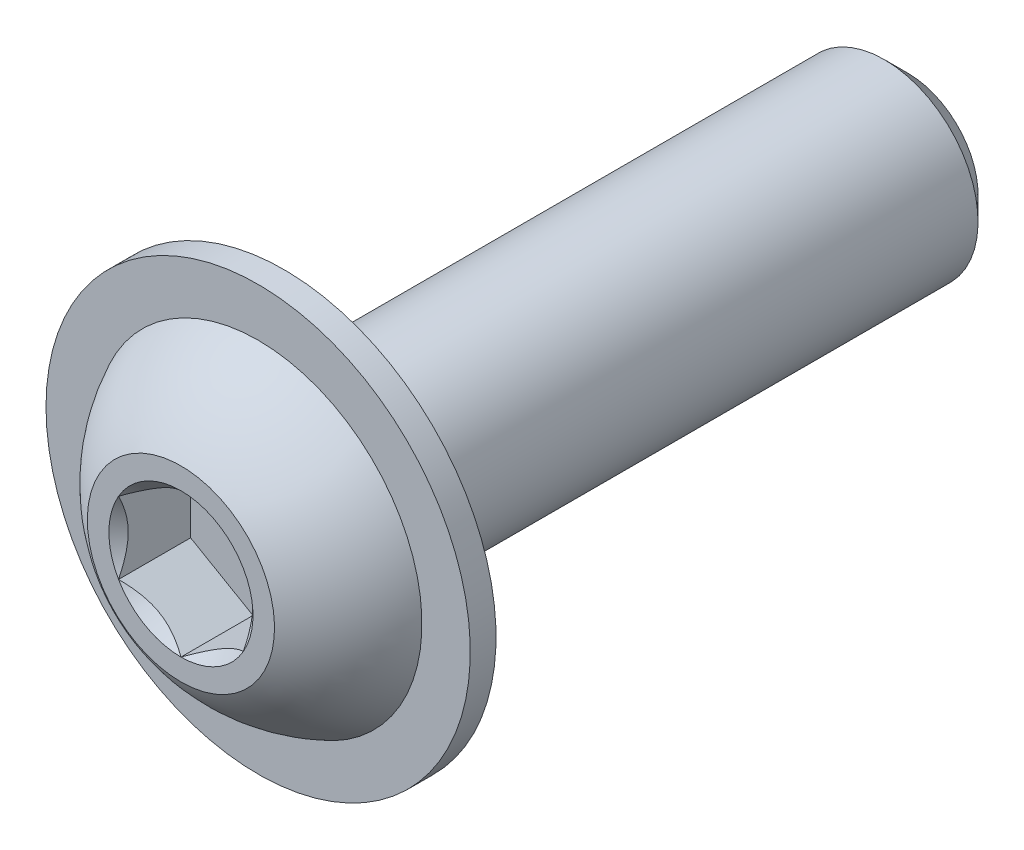
ISO-10303-21;
HEADER;
FILE_DESCRIPTION(('STEP AP214'),'2;1');
FILE_NAME('part.step','',(''),(''),'','','');
FILE_SCHEMA(('AUTOMOTIVE_DESIGN { 1 0 10303 214 1 1 1 1 }'));
ENDSEC;
DATA;
#1=APPLICATION_CONTEXT('core data for automotive mechanical design processes');
#2=APPLICATION_PROTOCOL_DEFINITION('international standard','automotive_design',2000,#1);
#3=PRODUCT_CONTEXT('',#1,'mechanical');
#4=PRODUCT('Part','Part','',(#3));
#5=PRODUCT_RELATED_PRODUCT_CATEGORY('part','',(#4));
#6=PRODUCT_DEFINITION_FORMATION('','',#4);
#7=PRODUCT_DEFINITION_CONTEXT('part definition',#1,'design');
#8=PRODUCT_DEFINITION('design','',#6,#7);
#9=PRODUCT_DEFINITION_SHAPE('','',#8);
#10=(LENGTH_UNIT() NAMED_UNIT(*) SI_UNIT(.MILLI.,.METRE.));
#11=(NAMED_UNIT(*) PLANE_ANGLE_UNIT() SI_UNIT($,.RADIAN.));
#12=(NAMED_UNIT(*) SI_UNIT($,.STERADIAN.) SOLID_ANGLE_UNIT());
#13=UNCERTAINTY_MEASURE_WITH_UNIT(LENGTH_MEASURE(1.E-05),#10,'distance_accuracy_value','');
#14=(GEOMETRIC_REPRESENTATION_CONTEXT(3) GLOBAL_UNCERTAINTY_ASSIGNED_CONTEXT((#13)) GLOBAL_UNIT_ASSIGNED_CONTEXT((#10,
#11,#12)) REPRESENTATION_CONTEXT('',''));
#15=CARTESIAN_POINT('',(0.,0.,0.));
#16=DIRECTION('',(0.,0.,1.));
#17=DIRECTION('',(1.,0.,0.));
#18=AXIS2_PLACEMENT_3D('',#15,#16,#17);
#19=CARTESIAN_POINT('',(0.,-3.,-23.3));
#20=DIRECTION('',(0.,0.,-1.));
#21=DIRECTION('',(0.,1.,0.));
#22=AXIS2_PLACEMENT_3D('',#19,#20,#21);
#23=PLANE('',#22);
#24=CARTESIAN_POINT('',(0.,0.,-23.3));
#25=DIRECTION('',(0.,0.,-1.));
#26=DIRECTION('',(0.,1.,0.));
#27=AXIS2_PLACEMENT_3D('',#24,#25,#26);
#28=CIRCLE('',#27,2.25000000000001);
#29=CARTESIAN_POINT('',(0.,2.25000000000001,-23.3));
#30=VERTEX_POINT('',#29);
#31=EDGE_CURVE('E203',#30,#30,#28,.T.);
#32=ORIENTED_EDGE('',*,*,#31,.T.);
#33=EDGE_LOOP('',(#32));
#34=FACE_BOUND('',#33,.T.);
#35=ADVANCED_FACE('F41',(#34),#23,.T.);
#36=CARTESIAN_POINT('',(0.,0.,-23.3));
#37=DIRECTION('',(0.,0.,-1.));
#38=DIRECTION('',(0.,1.,0.));
#39=AXIS2_PLACEMENT_3D('',#36,#37,#38);
#40=CYLINDRICAL_SURFACE('',#39,3.);
#41=CARTESIAN_POINT('',(0.,0.,-22.55));
#42=DIRECTION('',(0.,0.,-1.));
#43=DIRECTION('',(0.,1.,0.));
#44=AXIS2_PLACEMENT_3D('',#41,#42,#43);
#45=CIRCLE('',#44,3.);
#46=CARTESIAN_POINT('',(0.,3.,-22.55));
#47=VERTEX_POINT('',#46);
#48=EDGE_CURVE('E56',#47,#47,#45,.F.);
#49=ORIENTED_EDGE('',*,*,#48,.T.);
#50=EDGE_LOOP('',(#49));
#51=FACE_BOUND('',#50,.T.);
#52=CARTESIAN_POINT('',(0.,0.,-3.3));
#53=DIRECTION('',(0.,0.,1.));
#54=DIRECTION('',(1.,0.,0.));
#55=AXIS2_PLACEMENT_3D('',#52,#53,#54);
#56=CIRCLE('',#55,3.);
#57=CARTESIAN_POINT('',(3.,0.,-3.3));
#58=VERTEX_POINT('',#57);
#59=EDGE_CURVE('E199',#58,#58,#56,.F.);
#60=ORIENTED_EDGE('',*,*,#59,.T.);
#61=EDGE_LOOP('',(#60));
#62=FACE_BOUND('',#61,.T.);
#63=ADVANCED_FACE('F210',(#51,#62),#40,.T.);
#64=CARTESIAN_POINT('',(0.,0.,-23.3));
#65=DIRECTION('',(0.,0.,1.));
#66=DIRECTION('',(0.,-1.,0.));
#67=AXIS2_PLACEMENT_3D('',#64,#65,#66);
#68=CONICAL_SURFACE('',#67,2.25000000000001,0.785398163397445);
#69=ORIENTED_EDGE('',*,*,#48,.F.);
#70=EDGE_LOOP('',(#69));
#71=FACE_BOUND('',#70,.T.);
#72=ORIENTED_EDGE('',*,*,#31,.F.);
#73=EDGE_LOOP('',(#72));
#74=FACE_BOUND('',#73,.T.);
#75=ADVANCED_FACE('F43',(#71,#74),#68,.T.);
#76=CARTESIAN_POINT('',(0.,-5.25,-3.3));
#77=DIRECTION('',(0.,0.,1.));
#78=DIRECTION('',(1.,0.,0.));
#79=AXIS2_PLACEMENT_3D('',#76,#77,#78);
#80=PLANE('',#79);
#81=ORIENTED_EDGE('',*,*,#59,.F.);
#82=EDGE_LOOP('',(#81));
#83=FACE_BOUND('',#82,.T.);
#84=CARTESIAN_POINT('',(0.,0.,-3.3));
#85=DIRECTION('',(0.,0.,-1.));
#86=DIRECTION('',(-1.,0.,0.));
#87=AXIS2_PLACEMENT_3D('',#84,#85,#86);
#88=CIRCLE('',#87,6.8);
#89=CARTESIAN_POINT('',(-6.8,0.,-3.3));
#90=VERTEX_POINT('',#89);
#91=EDGE_CURVE('E188',#90,#90,#88,.T.);
#92=ORIENTED_EDGE('',*,*,#91,.T.);
#93=EDGE_LOOP('',(#92));
#94=FACE_BOUND('',#93,.T.);
#95=ADVANCED_FACE('F215',(#83,#94),#80,.F.);
#96=CARTESIAN_POINT('',(0.,0.,-2.475));
#97=DIRECTION('',(0.,0.,-1.));
#98=DIRECTION('',(-1.,0.,0.));
#99=AXIS2_PLACEMENT_3D('',#96,#97,#98);
#100=PLANE('',#99);
#101=CARTESIAN_POINT('',(0.,0.,-2.475));
#102=DIRECTION('',(0.,0.,-1.));
#103=DIRECTION('',(-1.,0.,0.));
#104=AXIS2_PLACEMENT_3D('',#101,#102,#103);
#105=CIRCLE('',#104,6.8);
#106=CARTESIAN_POINT('',(-6.8,0.,-2.475));
#107=VERTEX_POINT('',#106);
#108=EDGE_CURVE('E183',#107,#107,#105,.T.);
#109=ORIENTED_EDGE('',*,*,#108,.F.);
#110=EDGE_LOOP('',(#109));
#111=FACE_BOUND('',#110,.T.);
#112=CARTESIAN_POINT('',(0.,0.,-2.475));
#113=DIRECTION('',(0.,0.,-1.));
#114=DIRECTION('',(-1.,0.,0.));
#115=AXIS2_PLACEMENT_3D('',#112,#113,#114);
#116=CIRCLE('',#115,5.25);
#117=CARTESIAN_POINT('',(0.,-5.25,-2.475));
#118=VERTEX_POINT('',#117);
#119=EDGE_CURVE('E187',#118,#118,#116,.T.);
#120=ORIENTED_EDGE('',*,*,#119,.T.);
#121=EDGE_LOOP('',(#120));
#122=FACE_BOUND('',#121,.T.);
#123=ADVANCED_FACE('F233',(#111,#122),#100,.F.);
#124=CARTESIAN_POINT('',(0.,0.,-2.475));
#125=DIRECTION('',(0.,0.,-1.));
#126=DIRECTION('',(-1.,0.,0.));
#127=AXIS2_PLACEMENT_3D('',#124,#125,#126);
#128=CYLINDRICAL_SURFACE('',#127,6.8);
#129=ORIENTED_EDGE('',*,*,#108,.T.);
#130=EDGE_LOOP('',(#129));
#131=FACE_BOUND('',#130,.T.);
#132=ORIENTED_EDGE('',*,*,#91,.F.);
#133=EDGE_LOOP('',(#132));
#134=FACE_BOUND('',#133,.T.);
#135=ADVANCED_FACE('F230',(#131,#134),#128,.T.);
#136=CARTESIAN_POINT('',(0.,-3.,0.));
#137=DIRECTION('',(0.,0.,-1.));
#138=DIRECTION('',(-1.,0.,0.));
#139=AXIS2_PLACEMENT_3D('',#136,#137,#138);
#140=PLANE('',#139);
#141=CARTESIAN_POINT('',(0.,0.,0.));
#142=DIRECTION('',(0.,0.,1.));
#143=DIRECTION('',(1.,0.,0.));
#144=AXIS2_PLACEMENT_3D('',#141,#142,#143);
#145=CIRCLE('',#144,2.3094010767585);
#146=CARTESIAN_POINT('',(-2.,1.15470053837925,0.));
#147=VERTEX_POINT('',#146);
#148=CARTESIAN_POINT('',(-2.,-1.15470053837925,0.));
#149=VERTEX_POINT('',#148);
#150=EDGE_CURVE('E69',#147,#149,#145,.T.);
#151=ORIENTED_EDGE('',*,*,#150,.F.);
#152=CARTESIAN_POINT('',(0.,2.3094010767585,0.));
#153=VERTEX_POINT('',#152);
#154=EDGE_CURVE('E146',#153,#147,#145,.T.);
#155=ORIENTED_EDGE('',*,*,#154,.F.);
#156=CARTESIAN_POINT('',(2.,1.15470053837925,0.));
#157=VERTEX_POINT('',#156);
#158=EDGE_CURVE('E141',#157,#153,#145,.T.);
#159=ORIENTED_EDGE('',*,*,#158,.F.);
#160=CARTESIAN_POINT('',(2.,-1.15470053837925,0.));
#161=VERTEX_POINT('',#160);
#162=EDGE_CURVE('E110',#161,#157,#145,.T.);
#163=ORIENTED_EDGE('',*,*,#162,.F.);
#164=CARTESIAN_POINT('',(0.,-2.3094010767585,0.));
#165=VERTEX_POINT('',#164);
#166=EDGE_CURVE('E101',#165,#161,#145,.T.);
#167=ORIENTED_EDGE('',*,*,#166,.F.);
#168=EDGE_CURVE('E62',#149,#165,#145,.T.);
#169=ORIENTED_EDGE('',*,*,#168,.F.);
#170=EDGE_LOOP('',(#151,#155,#159,#163,#167,#169));
#171=FACE_BOUND('',#170,.T.);
#172=CARTESIAN_POINT('',(0.,0.,0.));
#173=DIRECTION('',(0.,0.,1.));
#174=DIRECTION('',(1.,0.,0.));
#175=AXIS2_PLACEMENT_3D('',#172,#173,#174);
#176=CIRCLE('',#175,3.);
#177=CARTESIAN_POINT('',(0.,-3.,0.));
#178=VERTEX_POINT('',#177);
#179=EDGE_CURVE('E195',#178,#178,#176,.T.);
#180=ORIENTED_EDGE('',*,*,#179,.T.);
#181=EDGE_LOOP('',(#180));
#182=FACE_BOUND('',#181,.T.);
#183=ADVANCED_FACE('F138',(#171,#182),#140,.F.);
#184=CARTESIAN_POINT('',(0.,0.,-4.9875));
#185=DIRECTION('',(0.,0.,1.));
#186=DIRECTION('',(0.,-1.,0.));
#187=AXIS2_PLACEMENT_3D('',#184,#185,#186);
#188=SPHERICAL_SURFACE('',#187,5.82023678642029);
#189=CARTESIAN_POINT('',(0.,-3.,0.));
#190=CARTESIAN_POINT('',(0.,-3.03028420289884,-0.0182160171404805));
#191=CARTESIAN_POINT('',(0.,-3.0604024537021,-0.0367079272921058));
#192=CARTESIAN_POINT('',(0.,-3.12029714687073,-0.0742372549628669));
#193=CARTESIAN_POINT('',(0.,-3.1500735892361,-0.0932746724820026));
#194=CARTESIAN_POINT('',(0.,-3.20927476128223,-0.131888736233004));
#195=CARTESIAN_POINT('',(0.,-3.23869949096298,-0.15146538246487));
#196=CARTESIAN_POINT('',(0.,-3.29718748048685,-0.191151397561356));
#197=CARTESIAN_POINT('',(0.,-3.32625074032996,-0.211260766425976));
#198=CARTESIAN_POINT('',(0.,-3.38400614482375,-0.252005556938247));
#199=CARTESIAN_POINT('',(0.,-3.41269828947443,-0.272640978585899));
#200=CARTESIAN_POINT('',(0.,-3.46970194355215,-0.314431026779949));
#201=CARTESIAN_POINT('',(0.,-3.4980134529792,-0.335585653326347));
#202=CARTESIAN_POINT('',(0.,-3.55424644229443,-0.378407092086537));
#203=CARTESIAN_POINT('',(0.,-3.5821679221826,-0.400073904300327));
#204=CARTESIAN_POINT('',(0.,-3.63761158767924,-0.4439125249629));
#205=CARTESIAN_POINT('',(0.,-3.66513377328771,-0.466084333411683));
#206=CARTESIAN_POINT('',(0.,-3.7197697179341,-0.510925589613356));
#207=CARTESIAN_POINT('',(0.,-3.74688347697201,-0.533595037366247));
#208=CARTESIAN_POINT('',(0.,-3.80069357171985,-0.579424050102975));
#209=CARTESIAN_POINT('',(0.,-3.82738990742978,-0.602583615086813));
#210=CARTESIAN_POINT('',(0.,-3.88035629726865,-0.649385177588692));
#211=CARTESIAN_POINT('',(0.,-3.90662635139759,-0.673027175106733));
#212=CARTESIAN_POINT('',(0.,-3.95873146126904,-0.720785757900494));
#213=CARTESIAN_POINT('',(0.,-3.98456651701155,-0.744902343176214));
#214=CARTESIAN_POINT('',(0.,-4.03579305764359,-0.793602099233681));
#215=CARTESIAN_POINT('',(0.,-4.06118454253313,-0.818185270015429));
#216=CARTESIAN_POINT('',(0.,-4.11151551617632,-0.867810040013002));
#217=CARTESIAN_POINT('',(0.,-4.13645500492998,-0.892851639228828));
#218=CARTESIAN_POINT('',(0.,-4.18587371099773,-0.943384956909068));
#219=CARTESIAN_POINT('',(0.,-4.21035292831183,-0.968876675373483));
#220=CARTESIAN_POINT('',(0.,-4.25884296892189,-1.02030177300896));
#221=CARTESIAN_POINT('',(0.,-4.28285379221785,-1.04623515218002));
#222=CARTESIAN_POINT('',(0.,-4.33039907763335,-1.09853496613707));
#223=CARTESIAN_POINT('',(0.,-4.35393353975289,-1.12490140092306));
#224=CARTESIAN_POINT('',(0.,-4.40051829372119,-1.17805857732378));
#225=CARTESIAN_POINT('',(0.,-4.42356858556994,-1.2048493189385));
#226=CARTESIAN_POINT('',(0.,-4.46917735055741,-1.25884621941901));
#227=CARTESIAN_POINT('',(0.,-4.49173582369612,-1.28605237828479));
#228=CARTESIAN_POINT('',(0.,-4.5363534660172,-1.34087108584791));
#229=CARTESIAN_POINT('',(0.,-4.55841263519957,-1.36848363454526));
#230=CARTESIAN_POINT('',(0.,-4.60202435003835,-1.4241059595057));
#231=CARTESIAN_POINT('',(0.,-4.62357689569476,-1.45211573576879));
#232=CARTESIAN_POINT('',(0.,-4.6661682120175,-1.50852322178864));
#233=CARTESIAN_POINT('',(0.,-4.68720698268385,-1.53692093154541));
#234=CARTESIAN_POINT('',(0.,-4.72876376804039,-1.59409486175849));
#235=CARTESIAN_POINT('',(0.,-4.7492817827306,-1.6228710822148));
#236=CARTESIAN_POINT('',(0.,-4.78979024794497,-1.6807924854365));
#237=CARTESIAN_POINT('',(0.,-4.80978069846913,-1.70993766820189));
#238=CARTESIAN_POINT('',(0.,-4.84922740221028,-1.76858732522651));
#239=CARTESIAN_POINT('',(0.,-4.86868365542727,-1.79809179948573));
#240=CARTESIAN_POINT('',(0.,-4.90705550868671,-1.85745024945485));
#241=CARTESIAN_POINT('',(0.,-4.92597110872916,-1.88730422516475));
#242=CARTESIAN_POINT('',(0.,-4.96325537909849,-1.94735177205757));
#243=CARTESIAN_POINT('',(0.,-4.98162404942537,-1.97754534324049));
#244=CARTESIAN_POINT('',(0.,-5.01780836556591,-2.03826206228653));
#245=CARTESIAN_POINT('',(0.,-5.03562401137957,-2.06878521014965));
#246=CARTESIAN_POINT('',(0.,-5.07069636621364,-2.13015095489802));
#247=CARTESIAN_POINT('',(0.,-5.08795307523405,-2.16099355178328));
#248=CARTESIAN_POINT('',(0.,-5.12190183333915,-2.22298795907865));
#249=CARTESIAN_POINT('',(0.,-5.13859388242383,-2.25413976948877));
#250=CARTESIAN_POINT('',(0.,-5.17140777116705,-2.31674227260604));
#251=CARTESIAN_POINT('',(0.,-5.18752961082559,-2.34819296531321));
#252=CARTESIAN_POINT('',(0.,-5.21919777159946,-2.41138277697921));
#253=CARTESIAN_POINT('',(0.,-5.2347440927148,-2.44312189593804));
#254=CARTESIAN_POINT('',(0.,-5.25,-2.475));
#255=B_SPLINE_CURVE_WITH_KNOTS('',3,(#189,#190,#191,#192,#193,#194,#195,#196,#197,#198,#199,
#200,#201,#202,#203,#204,#205,#206,#207,#208,#209,#210,#211,#212,#213,#214,#215,#216,#217,#218,
#219,#220,#221,#222,#223,#224,#225,#226,#227,#228,#229,#230,#231,#232,#233,#234,#235,#236,#237,
#238,#239,#240,#241,#242,#243,#244,#245,#246,#247,#248,#249,#250,#251,#252,#253,#254),
.UNSPECIFIED.,.F.,.F.,(4,2,2,2,2,2,2,2,2,2,2,2,2,2,2,2,2,2,2,2,2,2,2,2,2,2,2,2,2,2,2,2,4),(0.,
0.106020256452207,0.212040512904414,0.318060769356621,0.424081025808828,0.530101282261034,
0.636121538713242,0.742141795165448,0.848162051617655,0.954182308069862,1.06020256452207,
1.16622282097428,1.27224307742648,1.37826333387869,1.4842835903309,1.5903038467831,
1.69632410323531,1.80234435968752,1.90836461613972,2.01438487259193,2.12040512904414,
2.22642538549635,2.33244564194855,2.43846589840076,2.54448615485297,2.65050641130517,
2.75652666775738,2.86254692420959,2.96856718066179,3.074587437114,3.18060769356621,
3.28662795001841,3.39264820647062),.UNSPECIFIED.);
#256=EDGE_CURVE('BSEAM224',#178,#118,#255,.T.);
#257=ORIENTED_EDGE('',*,*,#179,.F.);
#258=ORIENTED_EDGE('',*,*,#119,.F.);
#259=ORIENTED_EDGE('',*,*,#256,.T.);
#260=ORIENTED_EDGE('',*,*,#256,.F.);
#261=EDGE_LOOP('',(#257,#259,#258,#260));
#262=FACE_BOUND('',#261,.T.);
#263=ADVANCED_FACE('F224',(#262),#188,.T.);
#264=CARTESIAN_POINT('',(0.,0.,0.));
#265=DIRECTION('',(0.,0.,1.));
#266=DIRECTION('',(1.,0.,0.));
#267=AXIS2_PLACEMENT_3D('',#264,#265,#266);
#268=CONICAL_SURFACE('',#267,2.3094010767585,0.78539816339745);
#269=ORIENTED_EDGE('',*,*,#162,.T.);
#270=CARTESIAN_POINT('',(2.,-2.30294417292923,0.740771355027721));
#271=CARTESIAN_POINT('',(2.,-2.24687002663712,0.698443273625964));
#272=CARTESIAN_POINT('',(2.,-2.19048190536959,0.656525156864338));
#273=CARTESIAN_POINT('',(2.,-2.07695390496424,0.573690417861018));
#274=CARTESIAN_POINT('',(2.,-2.01981384066454,0.532774049668074));
#275=CARTESIAN_POINT('',(2.,-1.90424016804776,0.451833452018563));
#276=CARTESIAN_POINT('',(2.,-1.8457999674391,0.411818591559868));
#277=CARTESIAN_POINT('',(2.,-1.7279274546176,0.333288993664293));
#278=CARTESIAN_POINT('',(2.,-1.66849521292324,0.294774150243142));
#279=CARTESIAN_POINT('',(2.,-1.4816299571002,0.177640651604294));
#280=CARTESIAN_POINT('',(2.,-1.35220318163536,0.102145901729643));
#281=CARTESIAN_POINT('',(2.,-1.08689521592924,-0.0359506490056199));
#282=CARTESIAN_POINT('',(2.,-0.951037763938191,-0.0985959140965052));
#283=CARTESIAN_POINT('',(2.,-0.747111912259408,-0.175236456124858));
#284=CARTESIAN_POINT('',(2.,-0.682064034147875,-0.197232820080878));
#285=CARTESIAN_POINT('',(2.,-0.550398103294752,-0.236003312339861));
#286=CARTESIAN_POINT('',(2.,-0.483779942722475,-0.252777080878818));
#287=CARTESIAN_POINT('',(2.,-0.350484328847654,-0.279951742115556));
#288=CARTESIAN_POINT('',(2.,-0.283829489364785,-0.290461823258315));
#289=CARTESIAN_POINT('',(2.,-0.149806987139376,-0.304903914455085));
#290=CARTESIAN_POINT('',(2.,-0.0824394489341212,-0.308837055266887));
#291=CARTESIAN_POINT('',(2.,0.0499055622944903,-0.309833523066283));
#292=CARTESIAN_POINT('',(2.,0.114881285143173,-0.307140355149592));
#293=CARTESIAN_POINT('',(2.,0.244275921482761,-0.295569929577308));
#294=CARTESIAN_POINT('',(2.,0.308694780266754,-0.286692071166777));
#295=CARTESIAN_POINT('',(2.,0.437599788610706,-0.263086340703852));
#296=CARTESIAN_POINT('',(2.,0.502067428644596,-0.248258916553489));
#297=CARTESIAN_POINT('',(2.,0.629594322598307,-0.213542116372031));
#298=CARTESIAN_POINT('',(2.,0.692653693883151,-0.193653163893725));
#299=CARTESIAN_POINT('',(2.,0.891187889210545,-0.123553020743802));
#300=CARTESIAN_POINT('',(2.,1.02383545707306,-0.0653581996784923));
#301=CARTESIAN_POINT('',(2.,1.28290932150074,0.0640305754595751));
#302=CARTESIAN_POINT('',(2.,1.4093111258757,0.13527123141484));
#303=CARTESIAN_POINT('',(2.,1.59200441438963,0.246441991874719));
#304=CARTESIAN_POINT('',(2.,1.65027549026191,0.283182190337373));
#305=CARTESIAN_POINT('',(2.,1.76581760389243,0.358214514183764));
#306=CARTESIAN_POINT('',(2.,1.82308856543105,0.396506757118038));
#307=CARTESIAN_POINT('',(2.,1.93629654762084,0.474042264081224));
#308=CARTESIAN_POINT('',(2.,1.99224062500539,0.513275276133584));
#309=CARTESIAN_POINT('',(2.,2.103364240299,0.592778830736515));
#310=CARTESIAN_POINT('',(2.,2.15854398422468,0.633049085000596));
#311=CARTESIAN_POINT('',(2.,2.21340370692659,0.673744238145941));
#312=B_SPLINE_CURVE_WITH_KNOTS('',3,(#270,#271,#272,#273,#274,#275,#276,#277,#278,#279,#280,
#281,#282,#283,#284,#285,#286,#287,#288,#289,#290,#291,#292,#293,#294,#295,#296,#297,#298,#299,
#300,#301,#302,#303,#304,#305,#306,#307,#308,#309,#310,#311),.UNSPECIFIED.,.F.,.F.,(4,2,2,2,2,2,
2,2,2,2,2,2,2,2,2,2,2,2,2,2,4),(0.,0.210772731976891,0.42159837465859,0.634057554623488,
0.846501695870171,1.29562155455624,1.74319622821645,1.94902062110207,2.15485918928326,
2.35699582502635,2.5590977043214,2.75388435553556,2.94868993014815,3.14690093452586,
3.34509535789702,3.77838155837654,4.21325029921625,4.41989056685647,4.62654651460921,
4.8315237711129,5.03644465914085),.UNSPECIFIED.);
#313=EDGE_CURVE('E11',#161,#157,#312,.T.);
#314=ORIENTED_EDGE('',*,*,#313,.F.);
#315=EDGE_LOOP('',(#269,#314));
#316=FACE_BOUND('',#315,.T.);
#317=ADVANCED_FACE('F114',(#316),#268,.F.);
#318=ORIENTED_EDGE('',*,*,#158,.T.);
#319=CARTESIAN_POINT('',(2.0002,1.15458506832541,0.000115478713658338));
#320=CARTESIAN_POINT('',(1.93144696596929,1.19427965103065,-0.0395469097744093));
#321=CARTESIAN_POINT('',(1.86154425786449,1.23463799837204,-0.0768800177158396));
#322=CARTESIAN_POINT('',(1.71900475544956,1.31693321846145,-0.145236314863858));
#323=CARTESIAN_POINT('',(1.64635440243464,1.35887791933134,-0.17622146626278));
#324=CARTESIAN_POINT('',(1.49985839894603,1.44345742638069,-0.229299783455858));
#325=CARTESIAN_POINT('',(1.42605006475371,1.48607068799507,-0.25152637282339));
#326=CARTESIAN_POINT('',(1.27680836816474,1.57223542169503,-0.28577118332492));
#327=CARTESIAN_POINT('',(1.20137956608185,1.61578426088223,-0.297814970855866));
#328=CARTESIAN_POINT('',(1.07138449932892,1.69083694766536,-0.308681488094429));
#329=CARTESIAN_POINT('',(1.01698621602989,1.72224381117151,-0.310290246390031));
#330=CARTESIAN_POINT('',(0.908278544480307,1.78500621460364,-0.30758112240129));
#331=CARTESIAN_POINT('',(0.853969194078661,1.81636173267754,-0.303261162242027));
#332=CARTESIAN_POINT('',(0.745863272410662,1.87877671565355,-0.288940432590095));
#333=CARTESIAN_POINT('',(0.692067343445208,1.90983580972306,-0.278933307237995));
#334=CARTESIAN_POINT('',(0.585405737694427,1.97141691651548,-0.253787569750342));
#335=CARTESIAN_POINT('',(0.532539989929288,2.00193897021859,-0.238649350957761));
#336=CARTESIAN_POINT('',(0.397120266910156,2.08012358375727,-0.193705496570811));
#337=CARTESIAN_POINT('',(0.315406165150521,2.12730124240478,-0.160511160574185));
#338=CARTESIAN_POINT('',(0.195252962742197,2.19667172615922,-0.104474176828631));
#339=CARTESIAN_POINT('',(0.155657147890822,2.21953238052245,-0.0847852970530605));
#340=CARTESIAN_POINT('',(0.0771990411121271,2.26483018959124,-0.043612681635129));
#341=CARTESIAN_POINT('',(0.038336316406259,2.28726759416161,-0.0221300483487533));
#342=CARTESIAN_POINT('',(-0.000200000000000792,2.30951654681234,0.000115478713659222));
#343=B_SPLINE_CURVE_WITH_KNOTS('',3,(#319,#320,#321,#322,#323,#324,#325,#326,#327,#328,#329,
#330,#331,#332,#333,#334,#335,#336,#337,#338,#339,#340,#341,#342),.UNSPECIFIED.,.F.,.F.,(4,2,2,
2,2,2,2,2,2,2,2,4),(0.,0.266420613771064,0.534393751523388,0.798110374376914,1.06116288956936,
1.24939906803722,1.43770123566247,1.62621426093932,1.81471283831913,2.11415604834145,
2.26347170717791,2.41269626969771),.UNSPECIFIED.);
#344=EDGE_CURVE('E145',#157,#153,#343,.T.);
#345=ORIENTED_EDGE('',*,*,#344,.F.);
#346=EDGE_LOOP('',(#318,#345));
#347=FACE_BOUND('',#346,.T.);
#348=ADVANCED_FACE('F330',(#347),#268,.F.);
#349=ORIENTED_EDGE('',*,*,#154,.T.);
#350=CARTESIAN_POINT('',(0.000199999999999145,2.30951654681234,0.000115478713659074));
#351=CARTESIAN_POINT('',(-0.0685530340307066,2.26982196410711,-0.0395469097744085));
#352=CARTESIAN_POINT('',(-0.138455742135513,2.22946361676572,-0.0768800177158388));
#353=CARTESIAN_POINT('',(-0.280995244550438,2.1471683966763,-0.145236314863858));
#354=CARTESIAN_POINT('',(-0.35364559756536,2.10522369580642,-0.17622146626278));
#355=CARTESIAN_POINT('',(-0.500141601053973,2.02064418875706,-0.229299783455858));
#356=CARTESIAN_POINT('',(-0.573949935246296,1.97803092714269,-0.25152637282339));
#357=CARTESIAN_POINT('',(-0.723191631835265,1.89186619344273,-0.28577118332492));
#358=CARTESIAN_POINT('',(-0.798620433918153,1.84831735425552,-0.297814970855866));
#359=CARTESIAN_POINT('',(-0.928615500671081,1.7732646674724,-0.308681488094429));
#360=CARTESIAN_POINT('',(-0.98301378397011,1.74185780396625,-0.31029024639003));
#361=CARTESIAN_POINT('',(-1.09172145551969,1.67909540053412,-0.307581122401289));
#362=CARTESIAN_POINT('',(-1.14603080592134,1.64773988246021,-0.303261162242027));
#363=CARTESIAN_POINT('',(-1.25413672758934,1.5853248994842,-0.288940432590095));
#364=CARTESIAN_POINT('',(-1.30793265655479,1.55426580541469,-0.278933307237994));
#365=CARTESIAN_POINT('',(-1.41459426230558,1.49268469862228,-0.253787569750341));
#366=CARTESIAN_POINT('',(-1.46746001007071,1.46216264491917,-0.238649350957761));
#367=CARTESIAN_POINT('',(-1.60287973308985,1.38397803138049,-0.19370549657081));
#368=CARTESIAN_POINT('',(-1.68459383484948,1.33680037273297,-0.160511160574184));
#369=CARTESIAN_POINT('',(-1.8047470372578,1.26742988897853,-0.104474176828631));
#370=CARTESIAN_POINT('',(-1.84434285210918,1.24456923461531,-0.0847852970530607));
#371=CARTESIAN_POINT('',(-1.92280095888787,1.19927142554652,-0.0436126816351295));
#372=CARTESIAN_POINT('',(-1.96166368359374,1.17683402097614,-0.0221300483487539));
#373=CARTESIAN_POINT('',(-2.0002,1.15458506832541,0.000115478713658771));
#374=B_SPLINE_CURVE_WITH_KNOTS('',3,(#350,#351,#352,#353,#354,#355,#356,#357,#358,#359,#360,
#361,#362,#363,#364,#365,#366,#367,#368,#369,#370,#371,#372,#373),.UNSPECIFIED.,.F.,.F.,(4,2,2,
2,2,2,2,2,2,2,2,4),(0.,0.266420613771064,0.534393751523389,0.798110374376915,1.06116288956936,
1.24939906803722,1.43770123566248,1.62621426093932,1.81471283831913,2.11415604834145,
2.26347170717791,2.41269626969771),.UNSPECIFIED.);
#375=EDGE_CURVE('E152',#153,#147,#374,.T.);
#376=ORIENTED_EDGE('',*,*,#375,.F.);
#377=EDGE_LOOP('',(#349,#376));
#378=FACE_BOUND('',#377,.T.);
#379=ADVANCED_FACE('F157',(#378),#268,.F.);
#380=ORIENTED_EDGE('',*,*,#150,.T.);
#381=CARTESIAN_POINT('',(-2.,-2.30294417292923,0.740771355027723));
#382=CARTESIAN_POINT('',(-2.,-2.24687002663712,0.698443273625965));
#383=CARTESIAN_POINT('',(-2.,-2.19048190536959,0.656525156864339));
#384=CARTESIAN_POINT('',(-2.,-2.07695390496424,0.573690417861019));
#385=CARTESIAN_POINT('',(-2.,-2.01981384066454,0.532774049668075));
#386=CARTESIAN_POINT('',(-2.,-1.90424016804776,0.451833452018565));
#387=CARTESIAN_POINT('',(-2.,-1.8457999674391,0.41181859155987));
#388=CARTESIAN_POINT('',(-2.,-1.7279274546176,0.333288993664295));
#389=CARTESIAN_POINT('',(-2.,-1.66849521292324,0.294774150243143));
#390=CARTESIAN_POINT('',(-2.,-1.4816299571002,0.177640651604295));
#391=CARTESIAN_POINT('',(-2.,-1.35220318163536,0.102145901729645));
#392=CARTESIAN_POINT('',(-2.,-1.08689521592925,-0.0359506490056186));
#393=CARTESIAN_POINT('',(-2.,-0.951037763938192,-0.0985959140965043));
#394=CARTESIAN_POINT('',(-2.,-0.747111912259409,-0.175236456124857));
#395=CARTESIAN_POINT('',(-2.,-0.682064034147876,-0.197232820080877));
#396=CARTESIAN_POINT('',(-2.,-0.550398103294752,-0.23600331233986));
#397=CARTESIAN_POINT('',(-2.,-0.483779942722475,-0.252777080878817));
#398=CARTESIAN_POINT('',(-2.,-0.350484328847654,-0.279951742115555));
#399=CARTESIAN_POINT('',(-2.,-0.283829489364785,-0.290461823258314));
#400=CARTESIAN_POINT('',(-2.,-0.149806987139376,-0.304903914455084));
#401=CARTESIAN_POINT('',(-2.,-0.0824394489341213,-0.308837055266886));
#402=CARTESIAN_POINT('',(-2.,0.0499055622944903,-0.309833523066283));
#403=CARTESIAN_POINT('',(-2.,0.114881285143173,-0.307140355149591));
#404=CARTESIAN_POINT('',(-2.,0.244275921482761,-0.295569929577308));
#405=CARTESIAN_POINT('',(-2.,0.308694780266754,-0.286692071166776));
#406=CARTESIAN_POINT('',(-2.,0.437599788610706,-0.263086340703851));
#407=CARTESIAN_POINT('',(-2.,0.502067428644596,-0.248258916553488));
#408=CARTESIAN_POINT('',(-2.,0.629594322598307,-0.21354211637203));
#409=CARTESIAN_POINT('',(-2.,0.692653693883151,-0.193653163893724));
#410=CARTESIAN_POINT('',(-2.,0.891187889210546,-0.123553020743801));
#411=CARTESIAN_POINT('',(-2.,1.02383545707306,-0.0653581996784913));
#412=CARTESIAN_POINT('',(-2.,1.28290932150074,0.0640305754595766));
#413=CARTESIAN_POINT('',(-2.,1.4093111258757,0.135271231414842));
#414=CARTESIAN_POINT('',(-2.,1.59200441438963,0.246441991874721));
#415=CARTESIAN_POINT('',(-2.,1.65027549026191,0.283182190337375));
#416=CARTESIAN_POINT('',(-2.,1.76581760389243,0.358214514183766));
#417=CARTESIAN_POINT('',(-2.,1.82308856543105,0.396506757118039));
#418=CARTESIAN_POINT('',(-2.,1.93629654762084,0.474042264081226));
#419=CARTESIAN_POINT('',(-2.,1.99224062500539,0.513275276133585));
#420=CARTESIAN_POINT('',(-2.,2.103364240299,0.592778830736516));
#421=CARTESIAN_POINT('',(-2.,2.15854398422468,0.633049085000597));
#422=CARTESIAN_POINT('',(-2.,2.21340370692659,0.673744238145942));
#423=B_SPLINE_CURVE_WITH_KNOTS('',3,(#381,#382,#383,#384,#385,#386,#387,#388,#389,#390,#391,
#392,#393,#394,#395,#396,#397,#398,#399,#400,#401,#402,#403,#404,#405,#406,#407,#408,#409,#410,
#411,#412,#413,#414,#415,#416,#417,#418,#419,#420,#421,#422),.UNSPECIFIED.,.F.,.F.,(4,2,2,2,2,2,
2,2,2,2,2,2,2,2,2,2,2,2,2,2,4),(0.,0.210772731976891,0.421598374658589,0.634057554623488,
0.846501695870171,1.29562155455624,1.74319622821645,1.94902062110208,2.15485918928326,
2.35699582502636,2.5590977043214,2.75388435553557,2.94868993014815,3.14690093452586,
3.34509535789702,3.77838155837654,4.21325029921625,4.41989056685647,4.62654651460921,
4.8315237711129,5.03644465914085),.UNSPECIFIED.);
#424=EDGE_CURVE('E162',#147,#149,#423,.F.);
#425=ORIENTED_EDGE('',*,*,#424,.F.);
#426=EDGE_LOOP('',(#380,#425));
#427=FACE_BOUND('',#426,.T.);
#428=ADVANCED_FACE('F324',(#427),#268,.F.);
#429=ORIENTED_EDGE('',*,*,#168,.T.);
#430=CARTESIAN_POINT('',(-2.0002,-1.15458506832541,0.000115478713659206));
#431=CARTESIAN_POINT('',(-1.9314469659693,-1.19427965103065,-0.0395469097744082));
#432=CARTESIAN_POINT('',(-1.86154425786449,-1.23463799837204,-0.0768800177158385));
#433=CARTESIAN_POINT('',(-1.71900475544956,-1.31693321846145,-0.145236314863857));
#434=CARTESIAN_POINT('',(-1.64635440243464,-1.35887791933134,-0.176221466262779));
#435=CARTESIAN_POINT('',(-1.49985839894603,-1.44345742638069,-0.229299783455857));
#436=CARTESIAN_POINT('',(-1.42605006475371,-1.48607068799507,-0.251526372823389));
#437=CARTESIAN_POINT('',(-1.27680836816474,-1.57223542169503,-0.28577118332492));
#438=CARTESIAN_POINT('',(-1.20137956608185,-1.61578426088223,-0.297814970855866));
#439=CARTESIAN_POINT('',(-1.07138449932892,-1.69083694766536,-0.308681488094429));
#440=CARTESIAN_POINT('',(-1.01698621602989,-1.72224381117151,-0.31029024639003));
#441=CARTESIAN_POINT('',(-0.908278544480307,-1.78500621460364,-0.307581122401289));
#442=CARTESIAN_POINT('',(-0.853969194078661,-1.81636173267754,-0.303261162242026));
#443=CARTESIAN_POINT('',(-0.745863272410662,-1.87877671565355,-0.288940432590094));
#444=CARTESIAN_POINT('',(-0.692067343445208,-1.90983580972306,-0.278933307237994));
#445=CARTESIAN_POINT('',(-0.585405737694426,-1.97141691651548,-0.253787569750341));
#446=CARTESIAN_POINT('',(-0.532539989929287,-2.00193897021859,-0.23864935095776));
#447=CARTESIAN_POINT('',(-0.397120266910156,-2.08012358375727,-0.19370549657081));
#448=CARTESIAN_POINT('',(-0.315406165150521,-2.12730124240478,-0.160511160574184));
#449=CARTESIAN_POINT('',(-0.195252962742198,-2.19667172615922,-0.104474176828631));
#450=CARTESIAN_POINT('',(-0.155657147890823,-2.21953238052245,-0.0847852970530602));
#451=CARTESIAN_POINT('',(-0.077199041112128,-2.26483018959124,-0.043612681635129));
#452=CARTESIAN_POINT('',(-0.0383363164062601,-2.28726759416161,-0.0221300483487535));
#453=CARTESIAN_POINT('',(0.000199999999999501,-2.30951654681234,0.000115478713659028));
#454=B_SPLINE_CURVE_WITH_KNOTS('',3,(#430,#431,#432,#433,#434,#435,#436,#437,#438,#439,#440,
#441,#442,#443,#444,#445,#446,#447,#448,#449,#450,#451,#452,#453),.UNSPECIFIED.,.F.,.F.,(4,2,2,
2,2,2,2,2,2,2,2,4),(0.,0.266420613771064,0.534393751523388,0.798110374376914,1.06116288956936,
1.24939906803722,1.43770123566248,1.62621426093932,1.81471283831913,2.11415604834145,
2.26347170717791,2.41269626969771),.UNSPECIFIED.);
#455=EDGE_CURVE('E127',#149,#165,#454,.T.);
#456=ORIENTED_EDGE('',*,*,#455,.F.);
#457=EDGE_LOOP('',(#429,#456));
#458=FACE_BOUND('',#457,.T.);
#459=ADVANCED_FACE('F263',(#458),#268,.F.);
#460=ORIENTED_EDGE('',*,*,#166,.T.);
#461=CARTESIAN_POINT('',(-0.000200000000000262,-2.30951654681234,0.000115478713659074));
#462=CARTESIAN_POINT('',(0.0685530340307052,-2.26982196410711,-0.0395469097744086));
#463=CARTESIAN_POINT('',(0.138455742135511,-2.22946361676572,-0.0768800177158388));
#464=CARTESIAN_POINT('',(0.280995244550437,-2.1471683966763,-0.145236314863858));
#465=CARTESIAN_POINT('',(0.353645597565359,-2.10522369580642,-0.17622146626278));
#466=CARTESIAN_POINT('',(0.500141601053972,-2.02064418875706,-0.229299783455858));
#467=CARTESIAN_POINT('',(0.573949935246295,-1.97803092714269,-0.25152637282339));
#468=CARTESIAN_POINT('',(0.723191631835265,-1.89186619344273,-0.285771183324921));
#469=CARTESIAN_POINT('',(0.798620433918153,-1.84831735425552,-0.297814970855866));
#470=CARTESIAN_POINT('',(0.92861550067108,-1.7732646674724,-0.308681488094429));
#471=CARTESIAN_POINT('',(0.98301378397011,-1.74185780396625,-0.310290246390031));
#472=CARTESIAN_POINT('',(1.09172145551969,-1.67909540053412,-0.30758112240129));
#473=CARTESIAN_POINT('',(1.14603080592134,-1.64773988246021,-0.303261162242027));
#474=CARTESIAN_POINT('',(1.25413672758934,-1.5853248994842,-0.288940432590095));
#475=CARTESIAN_POINT('',(1.30793265655479,-1.55426580541469,-0.278933307237995));
#476=CARTESIAN_POINT('',(1.41459426230557,-1.49268469862228,-0.253787569750342));
#477=CARTESIAN_POINT('',(1.46746001007071,-1.46216264491917,-0.238649350957761));
#478=CARTESIAN_POINT('',(1.60287973308985,-1.38397803138049,-0.19370549657081));
#479=CARTESIAN_POINT('',(1.68459383484948,-1.33680037273297,-0.160511160574185));
#480=CARTESIAN_POINT('',(1.8047470372578,-1.26742988897853,-0.104474176828631));
#481=CARTESIAN_POINT('',(1.84434285210918,-1.24456923461531,-0.0847852970530608));
#482=CARTESIAN_POINT('',(1.92280095888787,-1.19927142554652,-0.0436126816351294));
#483=CARTESIAN_POINT('',(1.96166368359374,-1.17683402097614,-0.0221300483487539));
#484=CARTESIAN_POINT('',(2.0002,-1.15458506832541,0.000115478713658336));
#485=B_SPLINE_CURVE_WITH_KNOTS('',3,(#461,#462,#463,#464,#465,#466,#467,#468,#469,#470,#471,
#472,#473,#474,#475,#476,#477,#478,#479,#480,#481,#482,#483,#484),.UNSPECIFIED.,.F.,.F.,(4,2,2,
2,2,2,2,2,2,2,2,4),(0.,0.266420613771064,0.53439375152339,0.798110374376916,1.06116288956937,
1.24939906803722,1.43770123566248,1.62621426093932,1.81471283831913,2.11415604834145,
2.26347170717791,2.41269626969771),.UNSPECIFIED.);
#486=EDGE_CURVE('E105',#165,#161,#485,.T.);
#487=ORIENTED_EDGE('',*,*,#486,.F.);
#488=EDGE_LOOP('',(#460,#487));
#489=FACE_BOUND('',#488,.T.);
#490=ADVANCED_FACE('F103',(#489),#268,.F.);
#491=CARTESIAN_POINT('',(2.,-1.15470053837925,-2.31));
#492=DIRECTION('',(0.,0.,1.));
#493=DIRECTION('',(1.,0.,0.));
#494=AXIS2_PLACEMENT_3D('',#491,#492,#493);
#495=PLANE('',#494);
#496=DIRECTION('',(0.866025403784438,0.5,0.));
#497=VECTOR('',#496,1.);
#498=CARTESIAN_POINT('',(0.,-2.3094010767585,-2.31));
#499=LINE('',#498,#497);
#500=CARTESIAN_POINT('',(0.,-2.3094010767585,-2.31));
#501=VERTEX_POINT('',#500);
#502=CARTESIAN_POINT('',(2.,-1.15470053837925,-2.31));
#503=VERTEX_POINT('',#502);
#504=EDGE_CURVE('E126',#501,#503,#499,.T.);
#505=ORIENTED_EDGE('',*,*,#504,.T.);
#506=DIRECTION('',(0.,1.,0.));
#507=VECTOR('',#506,1.);
#508=CARTESIAN_POINT('',(2.,-1.15470053837925,-2.31));
#509=LINE('',#508,#507);
#510=CARTESIAN_POINT('',(2.,1.15470053837925,-2.31));
#511=VERTEX_POINT('',#510);
#512=EDGE_CURVE('E131',#503,#511,#509,.T.);
#513=ORIENTED_EDGE('',*,*,#512,.T.);
#514=DIRECTION('',(-0.866025403784439,0.5,0.));
#515=VECTOR('',#514,1.);
#516=CARTESIAN_POINT('',(2.,1.15470053837925,-2.31));
#517=LINE('',#516,#515);
#518=CARTESIAN_POINT('',(0.,2.3094010767585,-2.31));
#519=VERTEX_POINT('',#518);
#520=EDGE_CURVE('E308',#511,#519,#517,.T.);
#521=ORIENTED_EDGE('',*,*,#520,.T.);
#522=DIRECTION('',(-0.866025403784438,-0.5,0.));
#523=VECTOR('',#522,1.);
#524=CARTESIAN_POINT('',(0.,2.3094010767585,-2.31));
#525=LINE('',#524,#523);
#526=CARTESIAN_POINT('',(-2.,1.15470053837925,-2.31));
#527=VERTEX_POINT('',#526);
#528=EDGE_CURVE('E171',#519,#527,#525,.T.);
#529=ORIENTED_EDGE('',*,*,#528,.T.);
#530=DIRECTION('',(0.,-1.,0.));
#531=VECTOR('',#530,1.);
#532=CARTESIAN_POINT('',(-2.,1.15470053837925,-2.31));
#533=LINE('',#532,#531);
#534=CARTESIAN_POINT('',(-2.,-1.15470053837925,-2.31));
#535=VERTEX_POINT('',#534);
#536=EDGE_CURVE('E314',#527,#535,#533,.T.);
#537=ORIENTED_EDGE('',*,*,#536,.T.);
#538=DIRECTION('',(0.866025403784439,-0.5,0.));
#539=VECTOR('',#538,1.);
#540=CARTESIAN_POINT('',(-2.,-1.15470053837925,-2.31));
#541=LINE('',#540,#539);
#542=EDGE_CURVE('E135',#535,#501,#541,.T.);
#543=ORIENTED_EDGE('',*,*,#542,.T.);
#544=EDGE_LOOP('',(#505,#513,#521,#529,#537,#543));
#545=FACE_BOUND('',#544,.T.);
#546=ADVANCED_FACE('F262',(#545),#495,.T.);
#547=CARTESIAN_POINT('',(2.,-1.15470053837925,-2.31));
#548=DIRECTION('',(1.,0.,0.));
#549=DIRECTION('',(0.,0.,-1.));
#550=AXIS2_PLACEMENT_3D('',#547,#548,#549);
#551=PLANE('',#550);
#552=DIRECTION('',(0.,0.,1.));
#553=VECTOR('',#552,1.);
#554=CARTESIAN_POINT('',(2.,-1.15470053837925,-2.31));
#555=LINE('',#554,#553);
#556=EDGE_CURVE('E122',#503,#161,#555,.T.);
#557=ORIENTED_EDGE('',*,*,#556,.T.);
#558=ORIENTED_EDGE('',*,*,#313,.T.);
#559=DIRECTION('',(0.,0.,1.));
#560=VECTOR('',#559,1.);
#561=CARTESIAN_POINT('',(2.,1.15470053837925,-2.31));
#562=LINE('',#561,#560);
#563=EDGE_CURVE('E134',#511,#157,#562,.T.);
#564=ORIENTED_EDGE('',*,*,#563,.F.);
#565=ORIENTED_EDGE('',*,*,#512,.F.);
#566=EDGE_LOOP('',(#557,#558,#564,#565));
#567=FACE_BOUND('',#566,.T.);
#568=ADVANCED_FACE('F129',(#567),#551,.F.);
#569=CARTESIAN_POINT('',(2.,1.15470053837925,-2.31));
#570=DIRECTION('',(0.5,0.866025403784439,0.));
#571=DIRECTION('',(-0.866025403784439,0.5,0.));
#572=AXIS2_PLACEMENT_3D('',#569,#570,#571);
#573=PLANE('',#572);
#574=ORIENTED_EDGE('',*,*,#563,.T.);
#575=ORIENTED_EDGE('',*,*,#344,.T.);
#576=DIRECTION('',(0.,0.,1.));
#577=VECTOR('',#576,1.);
#578=CARTESIAN_POINT('',(0.,2.3094010767585,-2.31));
#579=LINE('',#578,#577);
#580=EDGE_CURVE('E167',#519,#153,#579,.T.);
#581=ORIENTED_EDGE('',*,*,#580,.F.);
#582=ORIENTED_EDGE('',*,*,#520,.F.);
#583=EDGE_LOOP('',(#574,#575,#581,#582));
#584=FACE_BOUND('',#583,.T.);
#585=ADVANCED_FACE('F165',(#584),#573,.F.);
#586=CARTESIAN_POINT('',(0.,2.3094010767585,-2.31));
#587=DIRECTION('',(-0.5,0.866025403784438,0.));
#588=DIRECTION('',(-0.866025403784438,-0.5,0.));
#589=AXIS2_PLACEMENT_3D('',#586,#587,#588);
#590=PLANE('',#589);
#591=ORIENTED_EDGE('',*,*,#580,.T.);
#592=ORIENTED_EDGE('',*,*,#375,.T.);
#593=DIRECTION('',(0.,0.,1.));
#594=VECTOR('',#593,1.);
#595=CARTESIAN_POINT('',(-2.,1.15470053837925,-2.31));
#596=LINE('',#595,#594);
#597=EDGE_CURVE('E174',#527,#147,#596,.T.);
#598=ORIENTED_EDGE('',*,*,#597,.F.);
#599=ORIENTED_EDGE('',*,*,#528,.F.);
#600=EDGE_LOOP('',(#591,#592,#598,#599));
#601=FACE_BOUND('',#600,.T.);
#602=ADVANCED_FACE('F169',(#601),#590,.F.);
#603=CARTESIAN_POINT('',(-2.,1.15470053837925,-2.31));
#604=DIRECTION('',(-1.,0.,0.));
#605=DIRECTION('',(0.,0.,1.));
#606=AXIS2_PLACEMENT_3D('',#603,#604,#605);
#607=PLANE('',#606);
#608=ORIENTED_EDGE('',*,*,#597,.T.);
#609=ORIENTED_EDGE('',*,*,#424,.T.);
#610=DIRECTION('',(0.,0.,1.));
#611=VECTOR('',#610,1.);
#612=CARTESIAN_POINT('',(-2.,-1.15470053837925,-2.31));
#613=LINE('',#612,#611);
#614=EDGE_CURVE('E178',#535,#149,#613,.T.);
#615=ORIENTED_EDGE('',*,*,#614,.F.);
#616=ORIENTED_EDGE('',*,*,#536,.F.);
#617=EDGE_LOOP('',(#608,#609,#615,#616));
#618=FACE_BOUND('',#617,.T.);
#619=ADVANCED_FACE('F285',(#618),#607,.F.);
#620=CARTESIAN_POINT('',(-2.,-1.15470053837925,-2.31));
#621=DIRECTION('',(-0.5,-0.866025403784439,0.));
#622=DIRECTION('',(0.866025403784439,-0.5,0.));
#623=AXIS2_PLACEMENT_3D('',#620,#621,#622);
#624=PLANE('',#623);
#625=ORIENTED_EDGE('',*,*,#614,.T.);
#626=ORIENTED_EDGE('',*,*,#455,.T.);
#627=DIRECTION('',(0.,0.,1.));
#628=VECTOR('',#627,1.);
#629=CARTESIAN_POINT('',(0.,-2.3094010767585,-2.31));
#630=LINE('',#629,#628);
#631=EDGE_CURVE('E124',#501,#165,#630,.T.);
#632=ORIENTED_EDGE('',*,*,#631,.F.);
#633=ORIENTED_EDGE('',*,*,#542,.F.);
#634=EDGE_LOOP('',(#625,#626,#632,#633));
#635=FACE_BOUND('',#634,.T.);
#636=ADVANCED_FACE('F243',(#635),#624,.F.);
#637=CARTESIAN_POINT('',(0.,-2.3094010767585,-2.31));
#638=DIRECTION('',(0.5,-0.866025403784439,0.));
#639=DIRECTION('',(0.866025403784439,0.5,0.));
#640=AXIS2_PLACEMENT_3D('',#637,#638,#639);
#641=PLANE('',#640);
#642=ORIENTED_EDGE('',*,*,#631,.T.);
#643=ORIENTED_EDGE('',*,*,#486,.T.);
#644=ORIENTED_EDGE('',*,*,#556,.F.);
#645=ORIENTED_EDGE('',*,*,#504,.F.);
#646=EDGE_LOOP('',(#642,#643,#644,#645));
#647=FACE_BOUND('',#646,.T.);
#648=ADVANCED_FACE('F120',(#647),#641,.F.);
#649=CLOSED_SHELL('',(#35,#63,#75,#95,#123,#135,#183,#263,#317,#348,#379,#428,#459,#490,#546,
#568,#585,#602,#619,#636,#648));
#650=MANIFOLD_SOLID_BREP('B2',#649);
#651=ADVANCED_BREP_SHAPE_REPRESENTATION('',(#18,#650),#14);
#652=SHAPE_DEFINITION_REPRESENTATION(#9,#651);
ENDSEC;
END-ISO-10303-21;
